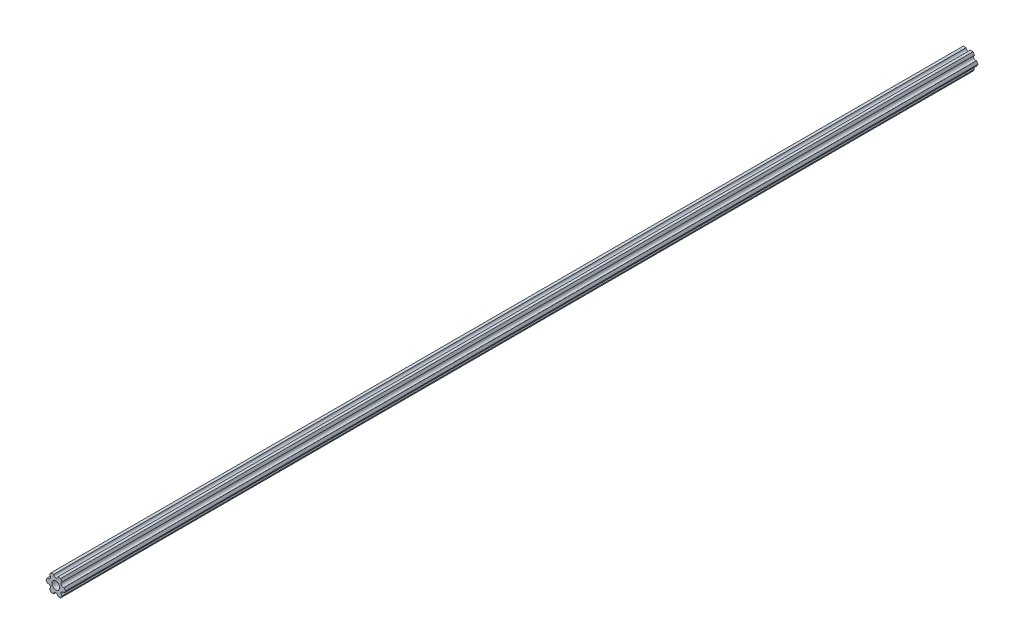
ISO-10303-21;
HEADER;
FILE_DESCRIPTION(('STEP AP214'),'2;1');
FILE_NAME('part.step','',(''),(''),'','','');
FILE_SCHEMA(('AUTOMOTIVE_DESIGN { 1 0 10303 214 1 1 1 1 }'));
ENDSEC;
DATA;
#1=APPLICATION_CONTEXT('core data for automotive mechanical design processes');
#2=APPLICATION_PROTOCOL_DEFINITION('international standard','automotive_design',2000,#1);
#3=PRODUCT_CONTEXT('',#1,'mechanical');
#4=PRODUCT('Part','Part','',(#3));
#5=PRODUCT_RELATED_PRODUCT_CATEGORY('part','',(#4));
#6=PRODUCT_DEFINITION_FORMATION('','',#4);
#7=PRODUCT_DEFINITION_CONTEXT('part definition',#1,'design');
#8=PRODUCT_DEFINITION('design','',#6,#7);
#9=PRODUCT_DEFINITION_SHAPE('','',#8);
#10=(LENGTH_UNIT() NAMED_UNIT(*) SI_UNIT(.MILLI.,.METRE.));
#11=(NAMED_UNIT(*) PLANE_ANGLE_UNIT() SI_UNIT($,.RADIAN.));
#12=(NAMED_UNIT(*) SI_UNIT($,.STERADIAN.) SOLID_ANGLE_UNIT());
#13=UNCERTAINTY_MEASURE_WITH_UNIT(LENGTH_MEASURE(1.E-05),#10,'distance_accuracy_value','');
#14=(GEOMETRIC_REPRESENTATION_CONTEXT(3) GLOBAL_UNCERTAINTY_ASSIGNED_CONTEXT((#13)) GLOBAL_UNIT_ASSIGNED_CONTEXT((#10,
#11,#12)) REPRESENTATION_CONTEXT('',''));
#15=CARTESIAN_POINT('',(0.,0.,0.));
#16=DIRECTION('',(0.,0.,1.));
#17=DIRECTION('',(1.,0.,0.));
#18=AXIS2_PLACEMENT_3D('',#15,#16,#17);
#19=CARTESIAN_POINT('',(6.29301142309098,-1.80018429024546,85.725));
#20=DIRECTION('',(-0.866025434075723,0.499999947533953,0.));
#21=DIRECTION('',(0.,0.,1.));
#22=AXIS2_PLACEMENT_3D('',#19,#20,#21);
#23=PLANE('',#22);
#24=DIRECTION('',(0.,0.,1.));
#25=VECTOR('',#24,1.);
#26=CARTESIAN_POINT('',(7.33234841870827,4.44212519169686E-07,85.725));
#27=LINE('',#26,#25);
#28=CARTESIAN_POINT('',(7.33234841870826,4.44212518961143E-07,-600.075));
#29=VERTEX_POINT('',#28);
#30=CARTESIAN_POINT('',(7.33234841870826,4.44212519315656E-07,85.725));
#31=VERTEX_POINT('',#30);
#32=EDGE_CURVE('E12',#29,#31,#27,.T.);
#33=ORIENTED_EDGE('',*,*,#32,.T.);
#34=DIRECTION('',(0.499999947533953,0.866025434075723,0.));
#35=VECTOR('',#34,1.);
#36=CARTESIAN_POINT('',(6.29301142309098,-1.80018429024546,85.725));
#37=LINE('',#36,#35);
#38=CARTESIAN_POINT('',(6.29301142309098,-1.80018429024546,85.725));
#39=VERTEX_POINT('',#38);
#40=EDGE_CURVE('E303',#39,#31,#37,.T.);
#41=ORIENTED_EDGE('',*,*,#40,.F.);
#42=DIRECTION('',(0.,0.,-1.));
#43=VECTOR('',#42,1.);
#44=CARTESIAN_POINT('',(6.29301142309098,-1.80018429024546,85.725));
#45=LINE('',#44,#43);
#46=CARTESIAN_POINT('',(6.29301142309098,-1.80018429024546,-600.075));
#47=VERTEX_POINT('',#46);
#48=EDGE_CURVE('E302',#39,#47,#45,.T.);
#49=ORIENTED_EDGE('',*,*,#48,.T.);
#50=DIRECTION('',(-0.499999947533953,-0.866025434075723,0.));
#51=VECTOR('',#50,1.);
#52=CARTESIAN_POINT('',(6.29301142309098,-1.80018429024546,-600.075));
#53=LINE('',#52,#51);
#54=EDGE_CURVE('E221',#29,#47,#53,.T.);
#55=ORIENTED_EDGE('',*,*,#54,.F.);
#56=EDGE_LOOP('',(#33,#41,#49,#55));
#57=FACE_BOUND('',#56,.T.);
#58=ADVANCED_FACE('F53',(#57),#23,.F.);
#59=CARTESIAN_POINT('',(7.33234841870827,4.44212519169686E-07,85.725));
#60=DIRECTION('',(-0.866025373493145,-0.500000052466057,0.));
#61=DIRECTION('',(-0.500000052466057,0.866025373493145,0.));
#62=AXIS2_PLACEMENT_3D('',#59,#60,#61);
#63=PLANE('',#62);
#64=DIRECTION('',(0.,0.,1.));
#65=VECTOR('',#64,1.);
#66=CARTESIAN_POINT('',(6.29301120497139,1.80018505273894,85.725));
#67=LINE('',#66,#65);
#68=CARTESIAN_POINT('',(6.29301120497139,1.80018505273894,-600.075));
#69=VERTEX_POINT('',#68);
#70=CARTESIAN_POINT('',(6.29301120497139,1.80018505273894,85.725));
#71=VERTEX_POINT('',#70);
#72=EDGE_CURVE('E61',#69,#71,#67,.T.);
#73=ORIENTED_EDGE('',*,*,#72,.T.);
#74=DIRECTION('',(-0.500000052466057,0.866025373493145,0.));
#75=VECTOR('',#74,1.);
#76=CARTESIAN_POINT('',(7.33234841870827,4.44212519198906E-07,85.725));
#77=LINE('',#76,#75);
#78=EDGE_CURVE('E307',#31,#71,#77,.T.);
#79=ORIENTED_EDGE('',*,*,#78,.F.);
#80=ORIENTED_EDGE('',*,*,#32,.F.);
#81=DIRECTION('',(0.500000052466055,-0.866025373493145,0.));
#82=VECTOR('',#81,1.);
#83=CARTESIAN_POINT('',(7.33234841870826,4.44212518961143E-07,-600.075));
#84=LINE('',#83,#82);
#85=EDGE_CURVE('E215',#69,#29,#84,.T.);
#86=ORIENTED_EDGE('',*,*,#85,.F.);
#87=EDGE_LOOP('',(#73,#79,#80,#86));
#88=FACE_BOUND('',#87,.T.);
#89=ADVANCED_FACE('F216',(#88),#63,.F.);
#90=CARTESIAN_POINT('',(4.70551103839172,4.54981561357972,85.725));
#91=DIRECTION('',(-0.866025373493151,-0.500000052466046,0.));
#92=DIRECTION('',(-0.500000052466046,0.866025373493151,0.));
#93=AXIS2_PLACEMENT_3D('',#90,#91,#92);
#94=PLANE('',#93);
#95=DIRECTION('',(0.,0.,1.));
#96=VECTOR('',#95,1.);
#97=CARTESIAN_POINT('',(3.66617382465481,6.35000022210627,85.725));
#98=LINE('',#97,#96);
#99=CARTESIAN_POINT('',(3.66617382465481,6.35000022210627,-600.075));
#100=VERTEX_POINT('',#99);
#101=CARTESIAN_POINT('',(3.66617382465481,6.35000022210627,85.725));
#102=VERTEX_POINT('',#101);
#103=EDGE_CURVE('E213',#100,#102,#98,.T.);
#104=ORIENTED_EDGE('',*,*,#103,.T.);
#105=DIRECTION('',(-0.500000052466046,0.866025373493151,0.));
#106=VECTOR('',#105,1.);
#107=CARTESIAN_POINT('',(4.70551103839172,4.54981561357972,85.725));
#108=LINE('',#107,#106);
#109=CARTESIAN_POINT('',(4.70551103839172,4.54981561357972,85.725));
#110=VERTEX_POINT('',#109);
#111=EDGE_CURVE('E338',#110,#102,#108,.T.);
#112=ORIENTED_EDGE('',*,*,#111,.F.);
#113=DIRECTION('',(0.,0.,1.));
#114=VECTOR('',#113,1.);
#115=CARTESIAN_POINT('',(4.70551103839172,4.54981561357972,85.725));
#116=LINE('',#115,#114);
#117=CARTESIAN_POINT('',(4.70551103839172,4.54981561357972,-600.075));
#118=VERTEX_POINT('',#117);
#119=EDGE_CURVE('E301',#118,#110,#116,.T.);
#120=ORIENTED_EDGE('',*,*,#119,.F.);
#121=DIRECTION('',(0.500000052466045,-0.866025373493151,0.));
#122=VECTOR('',#121,1.);
#123=CARTESIAN_POINT('',(4.70551103839172,4.54981561357972,-600.075));
#124=LINE('',#123,#122);
#125=EDGE_CURVE('E227',#100,#118,#124,.T.);
#126=ORIENTED_EDGE('',*,*,#125,.F.);
#127=EDGE_LOOP('',(#104,#112,#120,#126));
#128=FACE_BOUND('',#127,.T.);
#129=ADVANCED_FACE('F414',(#128),#94,.F.);
#130=CARTESIAN_POINT('',(3.66617382465481,6.35000022210627,85.725));
#131=DIRECTION('',(6.05825850611185E-08,-1.,0.));
#132=DIRECTION('',(0.,0.,-1.));
#133=AXIS2_PLACEMENT_3D('',#130,#131,#132);
#134=PLANE('',#133);
#135=DIRECTION('',(0.,0.,1.));
#136=VECTOR('',#135,1.);
#137=CARTESIAN_POINT('',(1.58749961530074,6.35000009617482,85.725));
#138=LINE('',#137,#136);
#139=CARTESIAN_POINT('',(1.58749961530073,6.35000015914054,-600.075));
#140=VERTEX_POINT('',#139);
#141=CARTESIAN_POINT('',(1.58749961530073,6.35000015914054,85.725));
#142=VERTEX_POINT('',#141);
#143=EDGE_CURVE('E335',#140,#142,#138,.T.);
#144=ORIENTED_EDGE('',*,*,#143,.T.);
#145=DIRECTION('',(-1.,0.,0.));
#146=VECTOR('',#145,1.);
#147=CARTESIAN_POINT('',(5.49926112168156,6.35000022210627,85.725));
#148=LINE('',#147,#146);
#149=EDGE_CURVE('E342',#102,#142,#148,.T.);
#150=ORIENTED_EDGE('',*,*,#149,.F.);
#151=ORIENTED_EDGE('',*,*,#103,.F.);
#152=DIRECTION('',(1.,3.02912931564594E-08,0.));
#153=VECTOR('',#152,1.);
#154=CARTESIAN_POINT('',(3.66617382465481,6.35000022210627,-600.075));
#155=LINE('',#154,#153);
#156=EDGE_CURVE('E289',#140,#100,#155,.T.);
#157=ORIENTED_EDGE('',*,*,#156,.F.);
#158=EDGE_LOOP('',(#144,#150,#151,#157));
#159=FACE_BOUND('',#158,.T.);
#160=ADVANCED_FACE('F417',(#159),#134,.F.);
#161=CARTESIAN_POINT('',(-3.84699260060323E-07,6.35,85.725));
#162=DIRECTION('',(0.,0.,-1.));
#163=DIRECTION('',(-1.,0.,0.));
#164=AXIS2_PLACEMENT_3D('',#161,#162,#163);
#165=CYLINDRICAL_SURFACE('',#164,1.5875);
#166=DIRECTION('',(0.,0.,1.));
#167=VECTOR('',#166,1.);
#168=CARTESIAN_POINT('',(-1.58750038469926,6.34999990382518,85.725));
#169=LINE('',#168,#167);
#170=CARTESIAN_POINT('',(-1.58750038469926,6.34999990382519,-600.075));
#171=VERTEX_POINT('',#170);
#172=CARTESIAN_POINT('',(-1.58750038469926,6.34999990382519,85.725));
#173=VERTEX_POINT('',#172);
#174=EDGE_CURVE('E332',#171,#173,#169,.T.);
#175=ORIENTED_EDGE('',*,*,#174,.T.);
#176=CARTESIAN_POINT('',(-3.84699260060323E-07,6.35,85.725));
#177=DIRECTION('',(0.,0.,-1.));
#178=DIRECTION('',(-1.,0.,0.));
#179=AXIS2_PLACEMENT_3D('',#176,#177,#178);
#180=CIRCLE('',#179,1.5875);
#181=EDGE_CURVE('E346',#142,#173,#180,.T.);
#182=ORIENTED_EDGE('',*,*,#181,.F.);
#183=ORIENTED_EDGE('',*,*,#143,.F.);
#184=CARTESIAN_POINT('',(-3.84699260060323E-07,6.35,-600.075));
#185=DIRECTION('',(0.,0.,1.));
#186=DIRECTION('',(-1.,0.,0.));
#187=AXIS2_PLACEMENT_3D('',#184,#185,#186);
#188=CIRCLE('',#187,1.5875);
#189=EDGE_CURVE('E285',#171,#140,#188,.T.);
#190=ORIENTED_EDGE('',*,*,#189,.F.);
#191=EDGE_LOOP('',(#175,#182,#183,#190));
#192=FACE_BOUND('',#191,.T.);
#193=ADVANCED_FACE('F466',(#192),#165,.F.);
#194=CARTESIAN_POINT('',(-1.58750038469926,6.34999990382518,85.725));
#195=DIRECTION('',(6.05825963273174E-08,-1.,0.));
#196=DIRECTION('',(0.,0.,-1.));
#197=AXIS2_PLACEMENT_3D('',#194,#195,#196);
#198=PLANE('',#197);
#199=DIRECTION('',(0.,0.,1.));
#200=VECTOR('',#199,1.);
#201=CARTESIAN_POINT('',(-3.66617459405349,6.3499997778937,85.725));
#202=LINE('',#201,#200);
#203=CARTESIAN_POINT('',(-3.66617454558244,6.34999986184803,-600.075));
#204=VERTEX_POINT('',#203);
#205=CARTESIAN_POINT('',(-3.66617454558244,6.34999986184803,85.725));
#206=VERTEX_POINT('',#205);
#207=EDGE_CURVE('E325',#204,#206,#202,.T.);
#208=ORIENTED_EDGE('',*,*,#207,.T.);
#209=DIRECTION('',(-1.,0.,0.));
#210=VECTOR('',#209,1.);
#211=CARTESIAN_POINT('',(5.49926112168156,6.34999990382519,85.725));
#212=LINE('',#211,#210);
#213=EDGE_CURVE('E350',#173,#206,#212,.T.);
#214=ORIENTED_EDGE('',*,*,#213,.F.);
#215=ORIENTED_EDGE('',*,*,#174,.F.);
#216=DIRECTION('',(1.,2.0194198968488E-08,0.));
#217=VECTOR('',#216,1.);
#218=CARTESIAN_POINT('',(-1.58750038469926,6.34999990382519,-600.075));
#219=LINE('',#218,#217);
#220=EDGE_CURVE('E281',#204,#171,#219,.T.);
#221=ORIENTED_EDGE('',*,*,#220,.F.);
#222=EDGE_LOOP('',(#208,#214,#215,#221));
#223=FACE_BOUND('',#222,.T.);
#224=ADVANCED_FACE('F463',(#223),#198,.F.);
#225=CARTESIAN_POINT('',(-3.66617459405349,6.3499997778937,85.725));
#226=DIRECTION('',(0.866025434075729,-0.499999947533942,0.));
#227=DIRECTION('',(0.,0.,-1.));
#228=AXIS2_PLACEMENT_3D('',#225,#226,#227);
#229=PLANE('',#228);
#230=DIRECTION('',(0.,0.,1.));
#231=VECTOR('',#230,1.);
#232=CARTESIAN_POINT('',(-4.70551158967065,4.54981504343587,85.725));
#233=LINE('',#232,#231);
#234=CARTESIAN_POINT('',(-4.70551158967065,4.54981504343587,-600.075));
#235=VERTEX_POINT('',#234);
#236=CARTESIAN_POINT('',(-4.70551158967065,4.54981504343587,85.725));
#237=VERTEX_POINT('',#236);
#238=EDGE_CURVE('E322',#235,#237,#233,.T.);
#239=ORIENTED_EDGE('',*,*,#238,.T.);
#240=DIRECTION('',(-0.499999947533943,-0.866025434075729,0.));
#241=VECTOR('',#240,1.);
#242=CARTESIAN_POINT('',(-3.66617459405349,6.3499997778937,85.725));
#243=LINE('',#242,#241);
#244=EDGE_CURVE('E354',#206,#237,#243,.T.);
#245=ORIENTED_EDGE('',*,*,#244,.F.);
#246=ORIENTED_EDGE('',*,*,#207,.F.);
#247=DIRECTION('',(0.499999947533939,0.866025434075731,0.));
#248=VECTOR('',#247,1.);
#249=CARTESIAN_POINT('',(-3.66617454558244,6.34999986184803,-600.075));
#250=LINE('',#249,#248);
#251=EDGE_CURVE('E277',#235,#204,#250,.T.);
#252=ORIENTED_EDGE('',*,*,#251,.F.);
#253=EDGE_LOOP('',(#239,#245,#246,#252));
#254=FACE_BOUND('',#253,.T.);
#255=ADVANCED_FACE('F459',(#254),#229,.F.);
#256=CARTESIAN_POINT('',(-5.49926150638082,3.17499966684067,85.725));
#257=DIRECTION('',(0.,0.,-1.));
#258=DIRECTION('',(-1.,0.,0.));
#259=AXIS2_PLACEMENT_3D('',#256,#257,#258);
#260=CYLINDRICAL_SURFACE('',#259,1.5875);
#261=DIRECTION('',(0.,0.,1.));
#262=VECTOR('',#261,1.);
#263=CARTESIAN_POINT('',(-6.29301142309098,1.80018429024547,85.725));
#264=LINE('',#263,#262);
#265=CARTESIAN_POINT('',(-6.29301142309098,1.80018429024546,-600.075));
#266=VERTEX_POINT('',#265);
#267=CARTESIAN_POINT('',(-6.29301142309098,1.80018429024547,85.725));
#268=VERTEX_POINT('',#267);
#269=EDGE_CURVE('E326',#266,#268,#264,.T.);
#270=ORIENTED_EDGE('',*,*,#269,.T.);
#271=CARTESIAN_POINT('',(-5.49926150638082,3.17499966684067,85.725));
#272=DIRECTION('',(0.,0.,-1.));
#273=DIRECTION('',(-1.,0.,0.));
#274=AXIS2_PLACEMENT_3D('',#271,#272,#273);
#275=CIRCLE('',#274,1.5875);
#276=EDGE_CURVE('E364',#237,#268,#275,.T.);
#277=ORIENTED_EDGE('',*,*,#276,.F.);
#278=ORIENTED_EDGE('',*,*,#238,.F.);
#279=CARTESIAN_POINT('',(-5.49926150638082,3.17499966684067,-600.075));
#280=DIRECTION('',(0.,0.,1.));
#281=DIRECTION('',(-1.,0.,0.));
#282=AXIS2_PLACEMENT_3D('',#279,#280,#281);
#283=CIRCLE('',#282,1.5875);
#284=EDGE_CURVE('E273',#266,#235,#283,.T.);
#285=ORIENTED_EDGE('',*,*,#284,.F.);
#286=EDGE_LOOP('',(#270,#277,#278,#285));
#287=FACE_BOUND('',#286,.T.);
#288=ADVANCED_FACE('F455',(#287),#260,.F.);
#289=CARTESIAN_POINT('',(-6.29301142309098,1.80018429024547,85.725));
#290=DIRECTION('',(0.866025434075724,-0.499999947533952,0.));
#291=DIRECTION('',(0.,0.,-1.));
#292=AXIS2_PLACEMENT_3D('',#289,#290,#291);
#293=PLANE('',#292);
#294=DIRECTION('',(0.,0.,1.));
#295=VECTOR('',#294,1.);
#296=CARTESIAN_POINT('',(-7.33234841870827,-4.44212523790841E-07,85.725));
#297=LINE('',#296,#295);
#298=CARTESIAN_POINT('',(-7.33234841870826,-4.44212524036367E-07,-600.075));
#299=VERTEX_POINT('',#298);
#300=CARTESIAN_POINT('',(-7.33234841870826,-4.44212524036367E-07,85.725));
#301=VERTEX_POINT('',#300);
#302=EDGE_CURVE('E319',#299,#301,#297,.T.);
#303=ORIENTED_EDGE('',*,*,#302,.T.);
#304=DIRECTION('',(-0.499999947533952,-0.866025434075724,0.));
#305=VECTOR('',#304,1.);
#306=CARTESIAN_POINT('',(-6.29301142309098,1.80018429024547,85.725));
#307=LINE('',#306,#305);
#308=EDGE_CURVE('E360',#268,#301,#307,.T.);
#309=ORIENTED_EDGE('',*,*,#308,.F.);
#310=ORIENTED_EDGE('',*,*,#269,.F.);
#311=DIRECTION('',(0.499999947533951,0.866025434075724,0.));
#312=VECTOR('',#311,1.);
#313=CARTESIAN_POINT('',(-6.29301142309098,1.80018429024547,-600.075));
#314=LINE('',#313,#312);
#315=EDGE_CURVE('E269',#299,#266,#314,.T.);
#316=ORIENTED_EDGE('',*,*,#315,.F.);
#317=EDGE_LOOP('',(#303,#309,#310,#316));
#318=FACE_BOUND('',#317,.T.);
#319=ADVANCED_FACE('F451',(#318),#293,.F.);
#320=CARTESIAN_POINT('',(-7.33234841870827,-4.44212523790841E-07,85.725));
#321=DIRECTION('',(0.866025373493151,0.500000052466045,0.));
#322=DIRECTION('',(0.,0.,-1.));
#323=AXIS2_PLACEMENT_3D('',#320,#321,#322);
#324=PLANE('',#323);
#325=DIRECTION('',(0.,0.,1.));
#326=VECTOR('',#325,1.);
#327=CARTESIAN_POINT('',(-6.29301120497141,-1.80018505273897,85.725));
#328=LINE('',#327,#326);
#329=CARTESIAN_POINT('',(-6.29301120497141,-1.80018505273897,-600.075));
#330=VERTEX_POINT('',#329);
#331=CARTESIAN_POINT('',(-6.29301120497141,-1.80018505273897,85.725));
#332=VERTEX_POINT('',#331);
#333=EDGE_CURVE('E312',#330,#332,#328,.T.);
#334=ORIENTED_EDGE('',*,*,#333,.T.);
#335=DIRECTION('',(0.500000052466045,-0.866025373493151,0.));
#336=VECTOR('',#335,1.);
#337=CARTESIAN_POINT('',(-7.33234841870827,-4.44212523969395E-07,85.725));
#338=LINE('',#337,#336);
#339=EDGE_CURVE('E355',#301,#332,#338,.T.);
#340=ORIENTED_EDGE('',*,*,#339,.F.);
#341=ORIENTED_EDGE('',*,*,#302,.F.);
#342=DIRECTION('',(-0.500000052466045,0.866025373493152,0.));
#343=VECTOR('',#342,1.);
#344=CARTESIAN_POINT('',(-7.33234841870826,-4.44212524036367E-07,-600.075));
#345=LINE('',#344,#343);
#346=EDGE_CURVE('E265',#330,#299,#345,.T.);
#347=ORIENTED_EDGE('',*,*,#346,.F.);
#348=EDGE_LOOP('',(#334,#340,#341,#347));
#349=FACE_BOUND('',#348,.T.);
#350=ADVANCED_FACE('F447',(#349),#324,.F.);
#351=CARTESIAN_POINT('',(-5.49926112168156,-3.17500033315934,85.725));
#352=DIRECTION('',(0.,0.,-1.));
#353=DIRECTION('',(-1.,0.,0.));
#354=AXIS2_PLACEMENT_3D('',#351,#352,#353);
#355=CYLINDRICAL_SURFACE('',#354,1.5875);
#356=DIRECTION('',(0.,0.,1.));
#357=VECTOR('',#356,1.);
#358=CARTESIAN_POINT('',(-4.70551103839172,-4.54981561357972,85.725));
#359=LINE('',#358,#357);
#360=CARTESIAN_POINT('',(-4.70551103839172,-4.54981561357972,-600.075));
#361=VERTEX_POINT('',#360);
#362=CARTESIAN_POINT('',(-4.70551103839172,-4.54981561357972,85.725));
#363=VERTEX_POINT('',#362);
#364=EDGE_CURVE('E309',#361,#363,#359,.T.);
#365=ORIENTED_EDGE('',*,*,#364,.T.);
#366=CARTESIAN_POINT('',(-5.49926112168156,-3.17500033315934,85.725));
#367=DIRECTION('',(0.,0.,-1.));
#368=DIRECTION('',(-1.,0.,0.));
#369=AXIS2_PLACEMENT_3D('',#366,#367,#368);
#370=CIRCLE('',#369,1.5875);
#371=EDGE_CURVE('E359',#332,#363,#370,.T.);
#372=ORIENTED_EDGE('',*,*,#371,.F.);
#373=ORIENTED_EDGE('',*,*,#333,.F.);
#374=CARTESIAN_POINT('',(-5.49926112168156,-3.17500033315934,-600.075));
#375=DIRECTION('',(0.,0.,1.));
#376=DIRECTION('',(-1.,0.,0.));
#377=AXIS2_PLACEMENT_3D('',#374,#375,#376);
#378=CIRCLE('',#377,1.5875);
#379=EDGE_CURVE('E261',#361,#330,#378,.T.);
#380=ORIENTED_EDGE('',*,*,#379,.F.);
#381=EDGE_LOOP('',(#365,#372,#373,#380));
#382=FACE_BOUND('',#381,.T.);
#383=ADVANCED_FACE('F443',(#382),#355,.F.);
#384=CARTESIAN_POINT('',(-4.70551103839172,-4.54981561357972,85.725));
#385=DIRECTION('',(0.866025373493152,0.500000052466045,0.));
#386=DIRECTION('',(0.,0.,-1.));
#387=AXIS2_PLACEMENT_3D('',#384,#385,#386);
#388=PLANE('',#387);
#389=DIRECTION('',(0.,0.,1.));
#390=VECTOR('',#389,1.);
#391=CARTESIAN_POINT('',(-3.66617382465481,-6.35000022210628,85.725));
#392=LINE('',#391,#390);
#393=CARTESIAN_POINT('',(-3.66617382465481,-6.35000022210628,-600.075));
#394=VERTEX_POINT('',#393);
#395=CARTESIAN_POINT('',(-3.66617382465481,-6.35000022210628,85.725));
#396=VERTEX_POINT('',#395);
#397=EDGE_CURVE('E313',#394,#396,#392,.T.);
#398=ORIENTED_EDGE('',*,*,#397,.T.);
#399=DIRECTION('',(0.500000052466045,-0.866025373493151,0.));
#400=VECTOR('',#399,1.);
#401=CARTESIAN_POINT('',(-4.70551103839172,-4.54981561357972,85.725));
#402=LINE('',#401,#400);
#403=EDGE_CURVE('E374',#363,#396,#402,.T.);
#404=ORIENTED_EDGE('',*,*,#403,.F.);
#405=ORIENTED_EDGE('',*,*,#364,.F.);
#406=DIRECTION('',(-0.500000052466043,0.866025373493152,0.));
#407=VECTOR('',#406,1.);
#408=CARTESIAN_POINT('',(-4.70551103839172,-4.54981561357972,-600.075));
#409=LINE('',#408,#407);
#410=EDGE_CURVE('E257',#394,#361,#409,.T.);
#411=ORIENTED_EDGE('',*,*,#410,.F.);
#412=EDGE_LOOP('',(#398,#404,#405,#411));
#413=FACE_BOUND('',#412,.T.);
#414=ADVANCED_FACE('F439',(#413),#388,.F.);
#415=CARTESIAN_POINT('',(-3.66617382465481,-6.35000022210628,85.725));
#416=DIRECTION('',(-6.05825854783851E-08,1.,0.));
#417=DIRECTION('',(0.,0.,1.));
#418=AXIS2_PLACEMENT_3D('',#415,#416,#417);
#419=PLANE('',#418);
#420=DIRECTION('',(0.,0.,1.));
#421=VECTOR('',#420,1.);
#422=CARTESIAN_POINT('',(-1.58749961530074,-6.35,85.725));
#423=LINE('',#422,#421);
#424=CARTESIAN_POINT('',(-1.58749961530073,-6.35000011105314,-600.075));
#425=VERTEX_POINT('',#424);
#426=CARTESIAN_POINT('',(-1.58749961530073,-6.35000011105314,85.725));
#427=VERTEX_POINT('',#426);
#428=EDGE_CURVE('E84',#425,#427,#423,.T.);
#429=ORIENTED_EDGE('',*,*,#428,.T.);
#430=DIRECTION('',(1.,0.,0.));
#431=VECTOR('',#430,1.);
#432=CARTESIAN_POINT('',(5.49926112168156,-6.35000022210628,85.725));
#433=LINE('',#432,#431);
#434=EDGE_CURVE('E378',#396,#427,#433,.T.);
#435=ORIENTED_EDGE('',*,*,#434,.F.);
#436=ORIENTED_EDGE('',*,*,#397,.F.);
#437=DIRECTION('',(-0.999999999999999,-5.34249856349036E-08,0.));
#438=VECTOR('',#437,1.);
#439=CARTESIAN_POINT('',(-3.66617382465481,-6.35000022210628,-600.075));
#440=LINE('',#439,#438);
#441=EDGE_CURVE('E253',#425,#394,#440,.T.);
#442=ORIENTED_EDGE('',*,*,#441,.F.);
#443=EDGE_LOOP('',(#429,#435,#436,#442));
#444=FACE_BOUND('',#443,.T.);
#445=ADVANCED_FACE('F436',(#444),#419,.F.);
#446=CARTESIAN_POINT('',(3.8469926204343E-07,-6.35,85.725));
#447=DIRECTION('',(0.,0.,-1.));
#448=DIRECTION('',(-1.,0.,0.));
#449=AXIS2_PLACEMENT_3D('',#446,#447,#448);
#450=CYLINDRICAL_SURFACE('',#449,1.5875);
#451=DIRECTION('',(0.,0.,1.));
#452=VECTOR('',#451,1.);
#453=CARTESIAN_POINT('',(1.58750038469926,-6.34999990382518,85.725));
#454=LINE('',#453,#452);
#455=CARTESIAN_POINT('',(1.58750038469926,-6.34999990382519,-600.075));
#456=VERTEX_POINT('',#455);
#457=CARTESIAN_POINT('',(1.58750038469926,-6.34999990382519,85.725));
#458=VERTEX_POINT('',#457);
#459=EDGE_CURVE('E73',#456,#458,#454,.T.);
#460=ORIENTED_EDGE('',*,*,#459,.T.);
#461=CARTESIAN_POINT('',(3.8469926204343E-07,-6.35,85.725));
#462=DIRECTION('',(0.,0.,-1.));
#463=DIRECTION('',(-1.,0.,0.));
#464=AXIS2_PLACEMENT_3D('',#461,#462,#463);
#465=CIRCLE('',#464,1.5875);
#466=EDGE_CURVE('E382',#427,#458,#465,.T.);
#467=ORIENTED_EDGE('',*,*,#466,.F.);
#468=ORIENTED_EDGE('',*,*,#428,.F.);
#469=CARTESIAN_POINT('',(3.8469926204343E-07,-6.35,-600.075));
#470=DIRECTION('',(0.,0.,1.));
#471=DIRECTION('',(-1.,0.,0.));
#472=AXIS2_PLACEMENT_3D('',#469,#470,#471);
#473=CIRCLE('',#472,1.5875);
#474=EDGE_CURVE('E249',#456,#425,#473,.T.);
#475=ORIENTED_EDGE('',*,*,#474,.F.);
#476=EDGE_LOOP('',(#460,#467,#468,#475));
#477=FACE_BOUND('',#476,.T.);
#478=ADVANCED_FACE('F434',(#477),#450,.F.);
#479=CARTESIAN_POINT('',(1.58750038469926,-6.34999990382518,85.725));
#480=DIRECTION('',(-6.05825721258438E-08,1.,0.));
#481=DIRECTION('',(0.,0.,1.));
#482=AXIS2_PLACEMENT_3D('',#479,#480,#481);
#483=PLANE('',#482);
#484=DIRECTION('',(0.,0.,1.));
#485=VECTOR('',#484,1.);
#486=CARTESIAN_POINT('',(3.66617459405346,-6.34999977789375,85.725));
#487=LINE('',#486,#485);
#488=CARTESIAN_POINT('',(3.66617454558244,-6.34999986184804,-600.075));
#489=VERTEX_POINT('',#488);
#490=CARTESIAN_POINT('',(3.66617454558244,-6.34999986184804,85.725));
#491=VERTEX_POINT('',#490);
#492=EDGE_CURVE('E383',#489,#491,#487,.T.);
#493=ORIENTED_EDGE('',*,*,#492,.T.);
#494=DIRECTION('',(1.,0.,0.));
#495=VECTOR('',#494,1.);
#496=CARTESIAN_POINT('',(5.49926112168156,-6.34999990382519,85.725));
#497=LINE('',#496,#495);
#498=EDGE_CURVE('E390',#458,#491,#497,.T.);
#499=ORIENTED_EDGE('',*,*,#498,.F.);
#500=ORIENTED_EDGE('',*,*,#459,.F.);
#501=DIRECTION('',(-1.,-2.01941943785532E-08,0.));
#502=VECTOR('',#501,1.);
#503=CARTESIAN_POINT('',(1.58750038469926,-6.34999990382519,-600.075));
#504=LINE('',#503,#502);
#505=EDGE_CURVE('E245',#489,#456,#504,.T.);
#506=ORIENTED_EDGE('',*,*,#505,.F.);
#507=EDGE_LOOP('',(#493,#499,#500,#506));
#508=FACE_BOUND('',#507,.T.);
#509=ADVANCED_FACE('F433',(#508),#483,.F.);
#510=CARTESIAN_POINT('',(3.66617459405346,-6.34999977789375,85.725));
#511=DIRECTION('',(-0.86602543407573,0.499999947533941,0.));
#512=DIRECTION('',(0.,0.,1.));
#513=AXIS2_PLACEMENT_3D('',#510,#511,#512);
#514=PLANE('',#513);
#515=DIRECTION('',(0.,0.,-1.));
#516=VECTOR('',#515,1.);
#517=CARTESIAN_POINT('',(4.70551158967065,-4.54981504343587,85.725));
#518=LINE('',#517,#516);
#519=CARTESIAN_POINT('',(4.70551158967065,-4.54981504343587,85.725));
#520=VERTEX_POINT('',#519);
#521=CARTESIAN_POINT('',(4.70551158967065,-4.54981504343587,-600.075));
#522=VERTEX_POINT('',#521);
#523=EDGE_CURVE('E386',#520,#522,#518,.T.);
#524=ORIENTED_EDGE('',*,*,#523,.F.);
#525=DIRECTION('',(0.49999994753394,0.86602543407573,0.));
#526=VECTOR('',#525,1.);
#527=CARTESIAN_POINT('',(3.66617459405346,-6.34999977789376,85.725));
#528=LINE('',#527,#526);
#529=EDGE_CURVE('E308',#491,#520,#528,.T.);
#530=ORIENTED_EDGE('',*,*,#529,.F.);
#531=ORIENTED_EDGE('',*,*,#492,.F.);
#532=DIRECTION('',(-0.499999947533941,-0.86602543407573,0.));
#533=VECTOR('',#532,1.);
#534=CARTESIAN_POINT('',(3.66617454558244,-6.34999986184804,-600.075));
#535=LINE('',#534,#533);
#536=EDGE_CURVE('E241',#522,#489,#535,.T.);
#537=ORIENTED_EDGE('',*,*,#536,.F.);
#538=EDGE_LOOP('',(#524,#530,#531,#537));
#539=FACE_BOUND('',#538,.T.);
#540=ADVANCED_FACE('F430',(#539),#514,.F.);
#541=CARTESIAN_POINT('',(5.49926112168156,3.17500033315934,85.725));
#542=DIRECTION('',(0.,0.,1.));
#543=DIRECTION('',(1.,0.,0.));
#544=AXIS2_PLACEMENT_3D('',#541,#542,#543);
#545=PLANE('',#544);
#546=CARTESIAN_POINT('',(0.,0.,85.725));
#547=DIRECTION('',(0.,0.,-1.));
#548=DIRECTION('',(-1.,0.,0.));
#549=AXIS2_PLACEMENT_3D('',#546,#547,#548);
#550=CIRCLE('',#549,2.9337);
#551=CARTESIAN_POINT('',(-2.9337,0.,85.725));
#552=VERTEX_POINT('',#551);
#553=EDGE_CURVE('E294',#552,#552,#550,.T.);
#554=ORIENTED_EDGE('',*,*,#553,.T.);
#555=EDGE_LOOP('',(#554));
#556=FACE_BOUND('',#555,.T.);
#557=ORIENTED_EDGE('',*,*,#529,.T.);
#558=CARTESIAN_POINT('',(5.49926150638082,-3.17499966684067,85.725));
#559=DIRECTION('',(0.,0.,-1.));
#560=DIRECTION('',(-1.,0.,0.));
#561=AXIS2_PLACEMENT_3D('',#558,#559,#560);
#562=CIRCLE('',#561,1.5875);
#563=EDGE_CURVE('E298',#520,#39,#562,.T.);
#564=ORIENTED_EDGE('',*,*,#563,.T.);
#565=ORIENTED_EDGE('',*,*,#40,.T.);
#566=ORIENTED_EDGE('',*,*,#78,.T.);
#567=CARTESIAN_POINT('',(5.49926112168156,3.17500033315934,85.725));
#568=DIRECTION('',(0.,0.,-1.));
#569=DIRECTION('',(-1.,0.,0.));
#570=AXIS2_PLACEMENT_3D('',#567,#568,#569);
#571=CIRCLE('',#570,1.5875);
#572=EDGE_CURVE('E208',#71,#110,#571,.T.);
#573=ORIENTED_EDGE('',*,*,#572,.T.);
#574=ORIENTED_EDGE('',*,*,#111,.T.);
#575=ORIENTED_EDGE('',*,*,#149,.T.);
#576=ORIENTED_EDGE('',*,*,#181,.T.);
#577=ORIENTED_EDGE('',*,*,#213,.T.);
#578=ORIENTED_EDGE('',*,*,#244,.T.);
#579=ORIENTED_EDGE('',*,*,#276,.T.);
#580=ORIENTED_EDGE('',*,*,#308,.T.);
#581=ORIENTED_EDGE('',*,*,#339,.T.);
#582=ORIENTED_EDGE('',*,*,#371,.T.);
#583=ORIENTED_EDGE('',*,*,#403,.T.);
#584=ORIENTED_EDGE('',*,*,#434,.T.);
#585=ORIENTED_EDGE('',*,*,#466,.T.);
#586=ORIENTED_EDGE('',*,*,#498,.T.);
#587=EDGE_LOOP('',(#557,#564,#565,#566,#573,#574,#575,#576,#577,#578,#579,#580,#581,#582,#583,
#584,#585,#586));
#588=FACE_BOUND('',#587,.T.);
#589=ADVANCED_FACE('F420',(#556,#588),#545,.T.);
#590=CARTESIAN_POINT('',(5.49926112168156,3.17500033315934,85.725));
#591=DIRECTION('',(0.,0.,-1.));
#592=DIRECTION('',(-1.,0.,0.));
#593=AXIS2_PLACEMENT_3D('',#590,#591,#592);
#594=CYLINDRICAL_SURFACE('',#593,1.5875);
#595=ORIENTED_EDGE('',*,*,#572,.F.);
#596=ORIENTED_EDGE('',*,*,#72,.F.);
#597=CARTESIAN_POINT('',(5.49926112168156,3.17500033315934,-600.075));
#598=DIRECTION('',(0.,0.,1.));
#599=DIRECTION('',(-1.,0.,0.));
#600=AXIS2_PLACEMENT_3D('',#597,#598,#599);
#601=CIRCLE('',#600,1.5875);
#602=EDGE_CURVE('E205',#118,#69,#601,.T.);
#603=ORIENTED_EDGE('',*,*,#602,.F.);
#604=ORIENTED_EDGE('',*,*,#119,.T.);
#605=EDGE_LOOP('',(#595,#596,#603,#604));
#606=FACE_BOUND('',#605,.T.);
#607=ADVANCED_FACE('F202',(#606),#594,.F.);
#608=CARTESIAN_POINT('',(5.49926150638082,-3.17499966684067,85.725));
#609=DIRECTION('',(0.,0.,-1.));
#610=DIRECTION('',(-1.,0.,0.));
#611=AXIS2_PLACEMENT_3D('',#608,#609,#610);
#612=CYLINDRICAL_SURFACE('',#611,1.5875);
#613=ORIENTED_EDGE('',*,*,#563,.F.);
#614=ORIENTED_EDGE('',*,*,#523,.T.);
#615=CARTESIAN_POINT('',(5.49926150638082,-3.17499966684067,-600.075));
#616=DIRECTION('',(0.,0.,1.));
#617=DIRECTION('',(-1.,0.,0.));
#618=AXIS2_PLACEMENT_3D('',#615,#616,#617);
#619=CIRCLE('',#618,1.5875);
#620=EDGE_CURVE('E237',#47,#522,#619,.T.);
#621=ORIENTED_EDGE('',*,*,#620,.F.);
#622=ORIENTED_EDGE('',*,*,#48,.F.);
#623=EDGE_LOOP('',(#613,#614,#621,#622));
#624=FACE_BOUND('',#623,.T.);
#625=ADVANCED_FACE('F425',(#624),#612,.F.);
#626=CARTESIAN_POINT('',(0.,0.,85.725));
#627=DIRECTION('',(0.,0.,-1.));
#628=DIRECTION('',(-1.,0.,0.));
#629=AXIS2_PLACEMENT_3D('',#626,#627,#628);
#630=CYLINDRICAL_SURFACE('',#629,2.9337);
#631=ORIENTED_EDGE('',*,*,#553,.F.);
#632=EDGE_LOOP('',(#631));
#633=FACE_BOUND('',#632,.T.);
#634=CARTESIAN_POINT('',(0.,0.,-600.075));
#635=DIRECTION('',(0.,0.,-1.));
#636=DIRECTION('',(-1.,0.,0.));
#637=AXIS2_PLACEMENT_3D('',#634,#635,#636);
#638=CIRCLE('',#637,2.9337);
#639=CARTESIAN_POINT('',(-2.9337,0.,-600.075));
#640=VERTEX_POINT('',#639);
#641=EDGE_CURVE('E229',#640,#640,#638,.T.);
#642=ORIENTED_EDGE('',*,*,#641,.T.);
#643=EDGE_LOOP('',(#642));
#644=FACE_BOUND('',#643,.T.);
#645=ADVANCED_FACE('F485',(#633,#644),#630,.F.);
#646=CARTESIAN_POINT('',(5.49926112168156,3.17500033315934,-600.075));
#647=DIRECTION('',(0.,0.,-1.));
#648=DIRECTION('',(-1.,0.,0.));
#649=AXIS2_PLACEMENT_3D('',#646,#647,#648);
#650=PLANE('',#649);
#651=ORIENTED_EDGE('',*,*,#602,.T.);
#652=ORIENTED_EDGE('',*,*,#85,.T.);
#653=ORIENTED_EDGE('',*,*,#54,.T.);
#654=ORIENTED_EDGE('',*,*,#620,.T.);
#655=ORIENTED_EDGE('',*,*,#536,.T.);
#656=ORIENTED_EDGE('',*,*,#505,.T.);
#657=ORIENTED_EDGE('',*,*,#474,.T.);
#658=ORIENTED_EDGE('',*,*,#441,.T.);
#659=ORIENTED_EDGE('',*,*,#410,.T.);
#660=ORIENTED_EDGE('',*,*,#379,.T.);
#661=ORIENTED_EDGE('',*,*,#346,.T.);
#662=ORIENTED_EDGE('',*,*,#315,.T.);
#663=ORIENTED_EDGE('',*,*,#284,.T.);
#664=ORIENTED_EDGE('',*,*,#251,.T.);
#665=ORIENTED_EDGE('',*,*,#220,.T.);
#666=ORIENTED_EDGE('',*,*,#189,.T.);
#667=ORIENTED_EDGE('',*,*,#156,.T.);
#668=ORIENTED_EDGE('',*,*,#125,.T.);
#669=EDGE_LOOP('',(#651,#652,#653,#654,#655,#656,#657,#658,#659,#660,#661,#662,#663,#664,#665,
#666,#667,#668));
#670=FACE_BOUND('',#669,.T.);
#671=ORIENTED_EDGE('',*,*,#641,.F.);
#672=EDGE_LOOP('',(#671));
#673=FACE_BOUND('',#672,.T.);
#674=ADVANCED_FACE('F223',(#670,#673),#650,.T.);
#675=CLOSED_SHELL('',(#58,#89,#129,#160,#193,#224,#255,#288,#319,#350,#383,#414,#445,#478,#509,
#540,#589,#607,#625,#645,#674));
#676=MANIFOLD_SOLID_BREP('B2',#675);
#677=ADVANCED_BREP_SHAPE_REPRESENTATION('',(#18,#676),#14);
#678=SHAPE_DEFINITION_REPRESENTATION(#9,#677);
ENDSEC;
END-ISO-10303-21;
